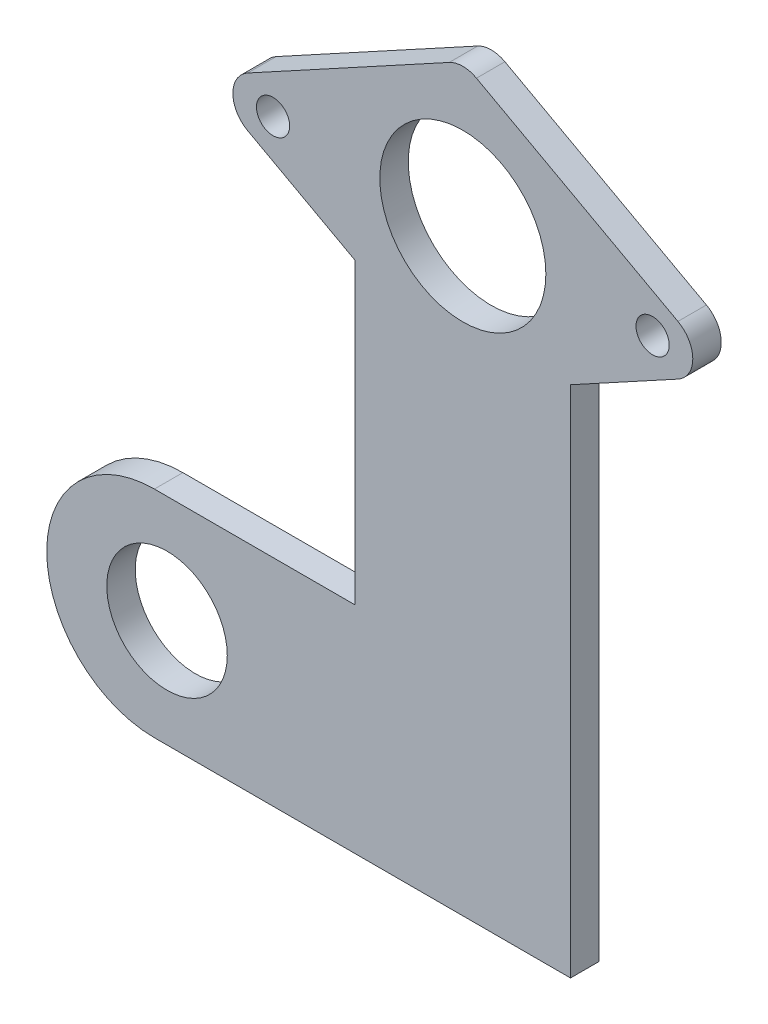
ISO-10303-21;
HEADER;
FILE_DESCRIPTION(('STEP AP214'),'2;1');
FILE_NAME('part.step','',(''),(''),'','','');
FILE_SCHEMA(('AUTOMOTIVE_DESIGN { 1 0 10303 214 1 1 1 1 }'));
ENDSEC;
DATA;
#1=APPLICATION_CONTEXT('core data for automotive mechanical design processes');
#2=APPLICATION_PROTOCOL_DEFINITION('international standard','automotive_design',2000,#1);
#3=PRODUCT_CONTEXT('',#1,'mechanical');
#4=PRODUCT('Part','Part','',(#3));
#5=PRODUCT_RELATED_PRODUCT_CATEGORY('part','',(#4));
#6=PRODUCT_DEFINITION_FORMATION('','',#4);
#7=PRODUCT_DEFINITION_CONTEXT('part definition',#1,'design');
#8=PRODUCT_DEFINITION('design','',#6,#7);
#9=PRODUCT_DEFINITION_SHAPE('','',#8);
#10=(LENGTH_UNIT() NAMED_UNIT(*) SI_UNIT(.MILLI.,.METRE.));
#11=(NAMED_UNIT(*) PLANE_ANGLE_UNIT() SI_UNIT($,.RADIAN.));
#12=(NAMED_UNIT(*) SI_UNIT($,.STERADIAN.) SOLID_ANGLE_UNIT());
#13=UNCERTAINTY_MEASURE_WITH_UNIT(LENGTH_MEASURE(1.E-05),#10,'distance_accuracy_value','');
#14=(GEOMETRIC_REPRESENTATION_CONTEXT(3) GLOBAL_UNCERTAINTY_ASSIGNED_CONTEXT((#13)) GLOBAL_UNIT_ASSIGNED_CONTEXT((#10,
#11,#12)) REPRESENTATION_CONTEXT('',''));
#15=CARTESIAN_POINT('',(0.,0.,0.));
#16=DIRECTION('',(0.,0.,1.));
#17=DIRECTION('',(1.,0.,0.));
#18=AXIS2_PLACEMENT_3D('',#15,#16,#17);
#19=CARTESIAN_POINT('',(-12.6114649681529,-23.1210191082803,6.));
#20=DIRECTION('',(-0.478852130680573,-0.877895572914384,0.));
#21=DIRECTION('',(0.877895572914385,-0.478852130680573,0.));
#22=AXIS2_PLACEMENT_3D('',#19,#20,#21);
#23=PLANE('',#22);
#24=DIRECTION('',(-0.877895572914384,0.478852130680573,0.));
#25=VECTOR('',#24,1.);
#26=CARTESIAN_POINT('',(-12.6114649681529,-23.1210191082803,0.));
#27=LINE('',#26,#25);
#28=CARTESIAN_POINT('',(-22.7,-17.6181818181818,0.));
#29=VERTEX_POINT('',#28);
#30=CARTESIAN_POINT('',(-45.3431486979417,-5.26737343748635,0.));
#31=VERTEX_POINT('',#30);
#32=EDGE_CURVE('E182',#29,#31,#27,.T.);
#33=ORIENTED_EDGE('',*,*,#32,.F.);
#34=DIRECTION('',(0.,0.,-1.));
#35=VECTOR('',#34,1.);
#36=CARTESIAN_POINT('',(-22.7,-17.6181818181818,6.));
#37=LINE('',#36,#35);
#38=CARTESIAN_POINT('',(-22.7,-17.6181818181818,6.));
#39=VERTEX_POINT('',#38);
#40=EDGE_CURVE('E11',#39,#29,#37,.T.);
#41=ORIENTED_EDGE('',*,*,#40,.F.);
#42=DIRECTION('',(-0.877895572914384,0.478852130680573,0.));
#43=VECTOR('',#42,1.);
#44=CARTESIAN_POINT('',(-12.6114649681529,-23.1210191082803,6.));
#45=LINE('',#44,#43);
#46=CARTESIAN_POINT('',(-45.3431486979417,-5.26737343748635,6.));
#47=VERTEX_POINT('',#46);
#48=EDGE_CURVE('E231',#39,#47,#45,.T.);
#49=ORIENTED_EDGE('',*,*,#48,.T.);
#50=DIRECTION('',(0.,0.,-1.));
#51=VECTOR('',#50,1.);
#52=CARTESIAN_POINT('',(-45.3431486979417,-5.26737343748635,6.));
#53=LINE('',#52,#51);
#54=EDGE_CURVE('E57',#47,#31,#53,.T.);
#55=ORIENTED_EDGE('',*,*,#54,.T.);
#56=EDGE_LOOP('',(#33,#41,#49,#55));
#57=FACE_BOUND('',#56,.T.);
#58=ADVANCED_FACE('F41',(#57),#23,.T.);
#59=CARTESIAN_POINT('',(-22.7,0.,6.));
#60=DIRECTION('',(-1.,0.,0.));
#61=DIRECTION('',(0.,-1.,0.));
#62=AXIS2_PLACEMENT_3D('',#59,#60,#61);
#63=PLANE('',#62);
#64=DIRECTION('',(0.,1.,0.));
#65=VECTOR('',#64,1.);
#66=CARTESIAN_POINT('',(-22.7,0.,0.));
#67=LINE('',#66,#65);
#68=CARTESIAN_POINT('',(-22.7,-80.51,0.));
#69=VERTEX_POINT('',#68);
#70=EDGE_CURVE('E184',#69,#29,#67,.T.);
#71=ORIENTED_EDGE('',*,*,#70,.F.);
#72=DIRECTION('',(0.,0.,-1.));
#73=VECTOR('',#72,1.);
#74=CARTESIAN_POINT('',(-22.7,-80.51,6.));
#75=LINE('',#74,#73);
#76=CARTESIAN_POINT('',(-22.7,-80.51,6.));
#77=VERTEX_POINT('',#76);
#78=EDGE_CURVE('E49',#77,#69,#75,.T.);
#79=ORIENTED_EDGE('',*,*,#78,.F.);
#80=DIRECTION('',(0.,1.,0.));
#81=VECTOR('',#80,1.);
#82=CARTESIAN_POINT('',(-22.7,0.,6.));
#83=LINE('',#82,#81);
#84=EDGE_CURVE('E276',#77,#39,#83,.T.);
#85=ORIENTED_EDGE('',*,*,#84,.T.);
#86=ORIENTED_EDGE('',*,*,#40,.T.);
#87=EDGE_LOOP('',(#71,#79,#85,#86));
#88=FACE_BOUND('',#87,.T.);
#89=ADVANCED_FACE('F261',(#88),#63,.T.);
#90=CARTESIAN_POINT('',(0.,-80.51,6.));
#91=DIRECTION('',(0.,1.,0.));
#92=DIRECTION('',(0.,0.,1.));
#93=AXIS2_PLACEMENT_3D('',#90,#91,#92);
#94=PLANE('',#93);
#95=DIRECTION('',(1.,0.,0.));
#96=VECTOR('',#95,1.);
#97=CARTESIAN_POINT('',(0.,-80.51,0.));
#98=LINE('',#97,#96);
#99=CARTESIAN_POINT('',(-65.0099999999998,-80.51,0.));
#100=VERTEX_POINT('',#99);
#101=EDGE_CURVE('E187',#100,#69,#98,.T.);
#102=ORIENTED_EDGE('',*,*,#101,.F.);
#103=DIRECTION('',(0.,0.,-1.));
#104=VECTOR('',#103,1.);
#105=CARTESIAN_POINT('',(-65.0099999999998,-80.51,6.));
#106=LINE('',#105,#104);
#107=CARTESIAN_POINT('',(-65.0099999999998,-80.51,6.));
#108=VERTEX_POINT('',#107);
#109=EDGE_CURVE('E250',#108,#100,#106,.T.);
#110=ORIENTED_EDGE('',*,*,#109,.F.);
#111=DIRECTION('',(1.,0.,0.));
#112=VECTOR('',#111,1.);
#113=CARTESIAN_POINT('',(0.,-80.51,6.));
#114=LINE('',#113,#112);
#115=EDGE_CURVE('E257',#108,#77,#114,.T.);
#116=ORIENTED_EDGE('',*,*,#115,.T.);
#117=ORIENTED_EDGE('',*,*,#78,.T.);
#118=EDGE_LOOP('',(#102,#110,#116,#117));
#119=FACE_BOUND('',#118,.T.);
#120=ADVANCED_FACE('F255',(#119),#94,.T.);
#121=CARTESIAN_POINT('',(-65.01,-103.2,6.));
#122=DIRECTION('',(0.,0.,-1.));
#123=DIRECTION('',(-1.,0.,0.));
#124=AXIS2_PLACEMENT_3D('',#121,#122,#123);
#125=CYLINDRICAL_SURFACE('',#124,22.69);
#126=CARTESIAN_POINT('',(-65.01,-103.2,0.));
#127=DIRECTION('',(0.,0.,1.));
#128=DIRECTION('',(1.,0.,0.));
#129=AXIS2_PLACEMENT_3D('',#126,#127,#128);
#130=CIRCLE('',#129,22.69);
#131=CARTESIAN_POINT('',(-87.7,-103.2,0.));
#132=VERTEX_POINT('',#131);
#133=EDGE_CURVE('E190',#100,#132,#130,.T.);
#134=ORIENTED_EDGE('',*,*,#133,.T.);
#135=DIRECTION('',(0.,0.,-1.));
#136=VECTOR('',#135,1.);
#137=CARTESIAN_POINT('',(-87.7,-103.2,6.));
#138=LINE('',#137,#136);
#139=CARTESIAN_POINT('',(-87.7,-103.2,6.));
#140=VERTEX_POINT('',#139);
#141=EDGE_CURVE('E248',#140,#132,#138,.T.);
#142=ORIENTED_EDGE('',*,*,#141,.F.);
#143=CARTESIAN_POINT('',(-65.01,-103.2,6.));
#144=DIRECTION('',(0.,0.,1.));
#145=DIRECTION('',(1.,0.,0.));
#146=AXIS2_PLACEMENT_3D('',#143,#144,#145);
#147=CIRCLE('',#146,22.69);
#148=EDGE_CURVE('E272',#108,#140,#147,.T.);
#149=ORIENTED_EDGE('',*,*,#148,.F.);
#150=ORIENTED_EDGE('',*,*,#109,.T.);
#151=EDGE_LOOP('',(#134,#142,#149,#150));
#152=FACE_BOUND('',#151,.T.);
#153=ADVANCED_FACE('F269',(#152),#125,.T.);
#154=CARTESIAN_POINT('',(-87.7,0.,6.));
#155=DIRECTION('',(-1.,0.,0.));
#156=DIRECTION('',(0.,0.,1.));
#157=AXIS2_PLACEMENT_3D('',#154,#155,#156);
#158=PLANE('',#157);
#159=DIRECTION('',(0.,1.,0.));
#160=VECTOR('',#159,1.);
#161=CARTESIAN_POINT('',(-87.7,0.,0.));
#162=LINE('',#161,#160);
#163=CARTESIAN_POINT('',(-87.7,-103.22,0.));
#164=VERTEX_POINT('',#163);
#165=EDGE_CURVE('E193',#164,#132,#162,.T.);
#166=ORIENTED_EDGE('',*,*,#165,.F.);
#167=DIRECTION('',(0.,0.,-1.));
#168=VECTOR('',#167,1.);
#169=CARTESIAN_POINT('',(-87.7,-103.22,6.));
#170=LINE('',#169,#168);
#171=CARTESIAN_POINT('',(-87.7,-103.22,6.));
#172=VERTEX_POINT('',#171);
#173=EDGE_CURVE('E246',#172,#164,#170,.T.);
#174=ORIENTED_EDGE('',*,*,#173,.F.);
#175=DIRECTION('',(0.,1.,0.));
#176=VECTOR('',#175,1.);
#177=CARTESIAN_POINT('',(-87.7,0.,6.));
#178=LINE('',#177,#176);
#179=EDGE_CURVE('E274',#172,#140,#178,.T.);
#180=ORIENTED_EDGE('',*,*,#179,.T.);
#181=ORIENTED_EDGE('',*,*,#141,.T.);
#182=EDGE_LOOP('',(#166,#174,#180,#181));
#183=FACE_BOUND('',#182,.T.);
#184=ADVANCED_FACE('F324',(#183),#158,.T.);
#185=CARTESIAN_POINT('',(-65.01,-103.22,6.));
#186=DIRECTION('',(0.,0.,-1.));
#187=DIRECTION('',(-1.,0.,0.));
#188=AXIS2_PLACEMENT_3D('',#185,#186,#187);
#189=CYLINDRICAL_SURFACE('',#188,22.69);
#190=CARTESIAN_POINT('',(-65.01,-103.22,0.));
#191=DIRECTION('',(0.,0.,1.));
#192=DIRECTION('',(1.,0.,0.));
#193=AXIS2_PLACEMENT_3D('',#190,#191,#192);
#194=CIRCLE('',#193,22.69);
#195=CARTESIAN_POINT('',(-65.0099999999998,-125.91,0.));
#196=VERTEX_POINT('',#195);
#197=EDGE_CURVE('E196',#196,#164,#194,.F.);
#198=ORIENTED_EDGE('',*,*,#197,.F.);
#199=DIRECTION('',(0.,0.,-1.));
#200=VECTOR('',#199,1.);
#201=CARTESIAN_POINT('',(-65.0099999999998,-125.91,6.));
#202=LINE('',#201,#200);
#203=CARTESIAN_POINT('',(-65.0099999999998,-125.91,6.));
#204=VERTEX_POINT('',#203);
#205=EDGE_CURVE('E244',#204,#196,#202,.T.);
#206=ORIENTED_EDGE('',*,*,#205,.F.);
#207=CARTESIAN_POINT('',(-65.01,-103.22,6.));
#208=DIRECTION('',(0.,0.,1.));
#209=DIRECTION('',(1.,0.,0.));
#210=AXIS2_PLACEMENT_3D('',#207,#208,#209);
#211=CIRCLE('',#210,22.69);
#212=EDGE_CURVE('E282',#204,#172,#211,.F.);
#213=ORIENTED_EDGE('',*,*,#212,.T.);
#214=ORIENTED_EDGE('',*,*,#173,.T.);
#215=EDGE_LOOP('',(#198,#206,#213,#214));
#216=FACE_BOUND('',#215,.T.);
#217=ADVANCED_FACE('F327',(#216),#189,.T.);
#218=CARTESIAN_POINT('',(0.,-125.91,6.));
#219=DIRECTION('',(0.,1.,0.));
#220=DIRECTION('',(-1.,0.,0.));
#221=AXIS2_PLACEMENT_3D('',#218,#219,#220);
#222=PLANE('',#221);
#223=DIRECTION('',(1.,0.,0.));
#224=VECTOR('',#223,1.);
#225=CARTESIAN_POINT('',(0.,-125.91,0.));
#226=LINE('',#225,#224);
#227=CARTESIAN_POINT('',(22.7,-125.91,0.));
#228=VERTEX_POINT('',#227);
#229=EDGE_CURVE('E199',#196,#228,#226,.T.);
#230=ORIENTED_EDGE('',*,*,#229,.T.);
#231=DIRECTION('',(0.,0.,-1.));
#232=VECTOR('',#231,1.);
#233=CARTESIAN_POINT('',(22.7,-125.91,6.));
#234=LINE('',#233,#232);
#235=CARTESIAN_POINT('',(22.7,-125.91,6.));
#236=VERTEX_POINT('',#235);
#237=EDGE_CURVE('E241',#236,#228,#234,.T.);
#238=ORIENTED_EDGE('',*,*,#237,.F.);
#239=DIRECTION('',(1.,0.,0.));
#240=VECTOR('',#239,1.);
#241=CARTESIAN_POINT('',(0.,-125.91,6.));
#242=LINE('',#241,#240);
#243=EDGE_CURVE('E285',#204,#236,#242,.T.);
#244=ORIENTED_EDGE('',*,*,#243,.F.);
#245=ORIENTED_EDGE('',*,*,#205,.T.);
#246=EDGE_LOOP('',(#230,#238,#244,#245));
#247=FACE_BOUND('',#246,.T.);
#248=ADVANCED_FACE('F331',(#247),#222,.F.);
#249=CARTESIAN_POINT('',(22.7,0.,6.));
#250=DIRECTION('',(-1.,0.,0.));
#251=DIRECTION('',(0.,0.,1.));
#252=AXIS2_PLACEMENT_3D('',#249,#250,#251);
#253=PLANE('',#252);
#254=DIRECTION('',(0.,1.,0.));
#255=VECTOR('',#254,1.);
#256=CARTESIAN_POINT('',(22.7,0.,0.));
#257=LINE('',#256,#255);
#258=CARTESIAN_POINT('',(22.7,-17.6181818181818,0.));
#259=VERTEX_POINT('',#258);
#260=EDGE_CURVE('E201',#228,#259,#257,.T.);
#261=ORIENTED_EDGE('',*,*,#260,.T.);
#262=DIRECTION('',(0.,0.,-1.));
#263=VECTOR('',#262,1.);
#264=CARTESIAN_POINT('',(22.7,-17.6181818181818,6.));
#265=LINE('',#264,#263);
#266=CARTESIAN_POINT('',(22.7,-17.6181818181818,6.));
#267=VERTEX_POINT('',#266);
#268=EDGE_CURVE('E239',#267,#259,#265,.T.);
#269=ORIENTED_EDGE('',*,*,#268,.F.);
#270=DIRECTION('',(0.,1.,0.));
#271=VECTOR('',#270,1.);
#272=CARTESIAN_POINT('',(22.7,0.,6.));
#273=LINE('',#272,#271);
#274=EDGE_CURVE('E287',#236,#267,#273,.T.);
#275=ORIENTED_EDGE('',*,*,#274,.F.);
#276=ORIENTED_EDGE('',*,*,#237,.T.);
#277=EDGE_LOOP('',(#261,#269,#275,#276));
#278=FACE_BOUND('',#277,.T.);
#279=ADVANCED_FACE('F335',(#278),#253,.F.);
#280=CARTESIAN_POINT('',(12.6114649681529,-23.1210191082803,6.));
#281=DIRECTION('',(0.478852130680573,-0.877895572914384,0.));
#282=DIRECTION('',(0.877895572914385,0.478852130680573,0.));
#283=AXIS2_PLACEMENT_3D('',#280,#281,#282);
#284=PLANE('',#283);
#285=DIRECTION('',(-0.877895572914384,-0.478852130680573,0.));
#286=VECTOR('',#285,1.);
#287=CARTESIAN_POINT('',(12.6114649681529,-23.1210191082803,0.));
#288=LINE('',#287,#286);
#289=CARTESIAN_POINT('',(45.3431486979417,-5.26737343748635,0.));
#290=VERTEX_POINT('',#289);
#291=EDGE_CURVE('E204',#290,#259,#288,.T.);
#292=ORIENTED_EDGE('',*,*,#291,.F.);
#293=DIRECTION('',(0.,0.,-1.));
#294=VECTOR('',#293,1.);
#295=CARTESIAN_POINT('',(45.3431486979417,-5.26737343748635,6.));
#296=LINE('',#295,#294);
#297=CARTESIAN_POINT('',(45.3431486979417,-5.26737343748635,6.));
#298=VERTEX_POINT('',#297);
#299=EDGE_CURVE('E237',#298,#290,#296,.T.);
#300=ORIENTED_EDGE('',*,*,#299,.F.);
#301=DIRECTION('',(-0.877895572914384,-0.478852130680573,0.));
#302=VECTOR('',#301,1.);
#303=CARTESIAN_POINT('',(12.6114649681529,-23.1210191082803,6.));
#304=LINE('',#303,#302);
#305=EDGE_CURVE('E289',#298,#267,#304,.T.);
#306=ORIENTED_EDGE('',*,*,#305,.T.);
#307=ORIENTED_EDGE('',*,*,#268,.T.);
#308=EDGE_LOOP('',(#292,#300,#306,#307));
#309=FACE_BOUND('',#308,.T.);
#310=ADVANCED_FACE('F339',(#309),#284,.T.);
#311=CARTESIAN_POINT('',(42.4700359138583,0.,6.));
#312=DIRECTION('',(0.,0.,-1.));
#313=DIRECTION('',(-1.,0.,0.));
#314=AXIS2_PLACEMENT_3D('',#311,#312,#313);
#315=CYLINDRICAL_SURFACE('',#314,6.);
#316=CARTESIAN_POINT('',(42.4700359138583,0.,0.));
#317=DIRECTION('',(0.,0.,1.));
#318=DIRECTION('',(1.,0.,0.));
#319=AXIS2_PLACEMENT_3D('',#316,#317,#318);
#320=CIRCLE('',#319,6.);
#321=CARTESIAN_POINT('',(45.3431486979417,5.26737343748636,0.));
#322=VERTEX_POINT('',#321);
#323=EDGE_CURVE('E207',#290,#322,#320,.T.);
#324=ORIENTED_EDGE('',*,*,#323,.T.);
#325=DIRECTION('',(0.,0.,-1.));
#326=VECTOR('',#325,1.);
#327=CARTESIAN_POINT('',(45.3431486979417,5.26737343748636,6.));
#328=LINE('',#327,#326);
#329=CARTESIAN_POINT('',(45.3431486979417,5.26737343748636,6.));
#330=VERTEX_POINT('',#329);
#331=EDGE_CURVE('E235',#330,#322,#328,.T.);
#332=ORIENTED_EDGE('',*,*,#331,.F.);
#333=CARTESIAN_POINT('',(42.4700359138583,0.,6.));
#334=DIRECTION('',(0.,0.,1.));
#335=DIRECTION('',(1.,0.,0.));
#336=AXIS2_PLACEMENT_3D('',#333,#334,#335);
#337=CIRCLE('',#336,6.);
#338=EDGE_CURVE('E292',#298,#330,#337,.T.);
#339=ORIENTED_EDGE('',*,*,#338,.F.);
#340=ORIENTED_EDGE('',*,*,#299,.T.);
#341=EDGE_LOOP('',(#324,#332,#339,#340));
#342=FACE_BOUND('',#341,.T.);
#343=ADVANCED_FACE('F343',(#342),#315,.T.);
#344=CARTESIAN_POINT('',(12.6114649681529,23.1210191082803,6.));
#345=DIRECTION('',(0.478852130680573,0.877895572914384,0.));
#346=DIRECTION('',(-0.877895572914385,0.478852130680573,0.));
#347=AXIS2_PLACEMENT_3D('',#344,#345,#346);
#348=PLANE('',#347);
#349=DIRECTION('',(0.877895572914384,-0.478852130680573,0.));
#350=VECTOR('',#349,1.);
#351=CARTESIAN_POINT('',(12.6114649681529,23.1210191082803,0.));
#352=LINE('',#351,#350);
#353=CARTESIAN_POINT('',(2.87311278408346,28.4328475723181,0.));
#354=VERTEX_POINT('',#353);
#355=EDGE_CURVE('E210',#354,#322,#352,.T.);
#356=ORIENTED_EDGE('',*,*,#355,.F.);
#357=DIRECTION('',(0.,0.,-1.));
#358=VECTOR('',#357,1.);
#359=CARTESIAN_POINT('',(2.87311278408346,28.4328475723181,6.));
#360=LINE('',#359,#358);
#361=CARTESIAN_POINT('',(2.87311278408346,28.4328475723181,6.));
#362=VERTEX_POINT('',#361);
#363=EDGE_CURVE('E162',#362,#354,#360,.T.);
#364=ORIENTED_EDGE('',*,*,#363,.F.);
#365=DIRECTION('',(0.877895572914384,-0.478852130680573,0.));
#366=VECTOR('',#365,1.);
#367=CARTESIAN_POINT('',(12.6114649681529,23.1210191082803,6.));
#368=LINE('',#367,#366);
#369=EDGE_CURVE('E152',#362,#330,#368,.T.);
#370=ORIENTED_EDGE('',*,*,#369,.T.);
#371=ORIENTED_EDGE('',*,*,#331,.T.);
#372=EDGE_LOOP('',(#356,#364,#370,#371));
#373=FACE_BOUND('',#372,.T.);
#374=ADVANCED_FACE('F295',(#373),#348,.T.);
#375=CARTESIAN_POINT('',(0.,23.1654741348318,6.));
#376=DIRECTION('',(0.,0.,-1.));
#377=DIRECTION('',(-1.,0.,0.));
#378=AXIS2_PLACEMENT_3D('',#375,#376,#377);
#379=CYLINDRICAL_SURFACE('',#378,6.);
#380=CARTESIAN_POINT('',(0.,23.1654741348318,0.));
#381=DIRECTION('',(0.,0.,1.));
#382=DIRECTION('',(1.,0.,0.));
#383=AXIS2_PLACEMENT_3D('',#380,#381,#382);
#384=CIRCLE('',#383,6.);
#385=CARTESIAN_POINT('',(-2.87311278408346,28.4328475723181,0.));
#386=VERTEX_POINT('',#385);
#387=EDGE_CURVE('E159',#354,#386,#384,.T.);
#388=ORIENTED_EDGE('',*,*,#387,.T.);
#389=DIRECTION('',(0.,0.,-1.));
#390=VECTOR('',#389,1.);
#391=CARTESIAN_POINT('',(-2.87311278408346,28.4328475723181,6.));
#392=LINE('',#391,#390);
#393=CARTESIAN_POINT('',(-2.87311278408346,28.4328475723181,6.));
#394=VERTEX_POINT('',#393);
#395=EDGE_CURVE('E156',#394,#386,#392,.T.);
#396=ORIENTED_EDGE('',*,*,#395,.F.);
#397=CARTESIAN_POINT('',(0.,23.1654741348318,6.));
#398=DIRECTION('',(0.,0.,1.));
#399=DIRECTION('',(1.,0.,0.));
#400=AXIS2_PLACEMENT_3D('',#397,#398,#399);
#401=CIRCLE('',#400,6.);
#402=EDGE_CURVE('E144',#362,#394,#401,.T.);
#403=ORIENTED_EDGE('',*,*,#402,.F.);
#404=ORIENTED_EDGE('',*,*,#363,.T.);
#405=EDGE_LOOP('',(#388,#396,#403,#404));
#406=FACE_BOUND('',#405,.T.);
#407=ADVANCED_FACE('F157',(#406),#379,.T.);
#408=CARTESIAN_POINT('',(-12.6114649681529,23.1210191082803,6.));
#409=DIRECTION('',(-0.478852130680573,0.877895572914384,0.));
#410=DIRECTION('',(-0.877895572914385,-0.478852130680573,0.));
#411=AXIS2_PLACEMENT_3D('',#408,#409,#410);
#412=PLANE('',#411);
#413=DIRECTION('',(0.877895572914384,0.478852130680573,0.));
#414=VECTOR('',#413,1.);
#415=CARTESIAN_POINT('',(-12.6114649681529,23.1210191082803,0.));
#416=LINE('',#415,#414);
#417=CARTESIAN_POINT('',(-45.3431486979417,5.26737343748635,0.));
#418=VERTEX_POINT('',#417);
#419=EDGE_CURVE('E214',#418,#386,#416,.T.);
#420=ORIENTED_EDGE('',*,*,#419,.F.);
#421=DIRECTION('',(0.,0.,-1.));
#422=VECTOR('',#421,1.);
#423=CARTESIAN_POINT('',(-45.3431486979417,5.26737343748635,6.));
#424=LINE('',#423,#422);
#425=CARTESIAN_POINT('',(-45.3431486979417,5.26737343748635,6.));
#426=VERTEX_POINT('',#425);
#427=EDGE_CURVE('E100',#426,#418,#424,.T.);
#428=ORIENTED_EDGE('',*,*,#427,.F.);
#429=DIRECTION('',(0.877895572914384,0.478852130680573,0.));
#430=VECTOR('',#429,1.);
#431=CARTESIAN_POINT('',(-12.6114649681529,23.1210191082803,6.));
#432=LINE('',#431,#430);
#433=EDGE_CURVE('E150',#426,#394,#432,.T.);
#434=ORIENTED_EDGE('',*,*,#433,.T.);
#435=ORIENTED_EDGE('',*,*,#395,.T.);
#436=EDGE_LOOP('',(#420,#428,#434,#435));
#437=FACE_BOUND('',#436,.T.);
#438=ADVANCED_FACE('F164',(#437),#412,.T.);
#439=CARTESIAN_POINT('',(-40.,0.,6.));
#440=DIRECTION('',(0.,0.,-1.));
#441=DIRECTION('',(-1.,0.,0.));
#442=AXIS2_PLACEMENT_3D('',#439,#440,#441);
#443=CYLINDRICAL_SURFACE('',#442,3.5);
#444=CARTESIAN_POINT('',(-40.,0.,6.));
#445=DIRECTION('',(0.,0.,1.));
#446=DIRECTION('',(1.,0.,0.));
#447=AXIS2_PLACEMENT_3D('',#444,#445,#446);
#448=CIRCLE('',#447,3.5);
#449=CARTESIAN_POINT('',(-36.5,0.,6.));
#450=VERTEX_POINT('',#449);
#451=EDGE_CURVE('E176',#450,#450,#448,.T.);
#452=ORIENTED_EDGE('',*,*,#451,.T.);
#453=EDGE_LOOP('',(#452));
#454=FACE_BOUND('',#453,.T.);
#455=CARTESIAN_POINT('',(-40.,0.,0.));
#456=DIRECTION('',(0.,0.,1.));
#457=DIRECTION('',(1.,0.,0.));
#458=AXIS2_PLACEMENT_3D('',#455,#456,#457);
#459=CIRCLE('',#458,3.5);
#460=CARTESIAN_POINT('',(-36.5,0.,0.));
#461=VERTEX_POINT('',#460);
#462=EDGE_CURVE('E225',#461,#461,#459,.T.);
#463=ORIENTED_EDGE('',*,*,#462,.F.);
#464=EDGE_LOOP('',(#463));
#465=FACE_BOUND('',#464,.T.);
#466=ADVANCED_FACE('F352',(#454,#465),#443,.F.);
#467=CARTESIAN_POINT('',(40.,0.,6.));
#468=DIRECTION('',(0.,0.,-1.));
#469=DIRECTION('',(-1.,0.,0.));
#470=AXIS2_PLACEMENT_3D('',#467,#468,#469);
#471=CYLINDRICAL_SURFACE('',#470,3.5);
#472=CARTESIAN_POINT('',(40.,0.,6.));
#473=DIRECTION('',(0.,0.,1.));
#474=DIRECTION('',(1.,0.,0.));
#475=AXIS2_PLACEMENT_3D('',#472,#473,#474);
#476=CIRCLE('',#475,3.5);
#477=CARTESIAN_POINT('',(43.5,0.,6.));
#478=VERTEX_POINT('',#477);
#479=EDGE_CURVE('E173',#478,#478,#476,.T.);
#480=ORIENTED_EDGE('',*,*,#479,.T.);
#481=EDGE_LOOP('',(#480));
#482=FACE_BOUND('',#481,.T.);
#483=CARTESIAN_POINT('',(40.,0.,0.));
#484=DIRECTION('',(0.,0.,1.));
#485=DIRECTION('',(1.,0.,0.));
#486=AXIS2_PLACEMENT_3D('',#483,#484,#485);
#487=CIRCLE('',#486,3.5);
#488=CARTESIAN_POINT('',(43.5,0.,0.));
#489=VERTEX_POINT('',#488);
#490=EDGE_CURVE('E222',#489,#489,#487,.T.);
#491=ORIENTED_EDGE('',*,*,#490,.F.);
#492=EDGE_LOOP('',(#491));
#493=FACE_BOUND('',#492,.T.);
#494=ADVANCED_FACE('F309',(#482,#493),#471,.F.);
#495=CARTESIAN_POINT('',(0.,0.,6.));
#496=DIRECTION('',(0.,0.,-1.));
#497=DIRECTION('',(-1.,0.,0.));
#498=AXIS2_PLACEMENT_3D('',#495,#496,#497);
#499=CYLINDRICAL_SURFACE('',#498,17.5);
#500=CARTESIAN_POINT('',(0.,0.,6.));
#501=DIRECTION('',(0.,0.,1.));
#502=DIRECTION('',(1.,0.,0.));
#503=AXIS2_PLACEMENT_3D('',#500,#501,#502);
#504=CIRCLE('',#503,17.5);
#505=CARTESIAN_POINT('',(17.5,0.,6.));
#506=VERTEX_POINT('',#505);
#507=EDGE_CURVE('E167',#506,#506,#504,.T.);
#508=ORIENTED_EDGE('',*,*,#507,.T.);
#509=EDGE_LOOP('',(#508));
#510=FACE_BOUND('',#509,.T.);
#511=CARTESIAN_POINT('',(0.,0.,0.));
#512=DIRECTION('',(0.,0.,1.));
#513=DIRECTION('',(1.,0.,0.));
#514=AXIS2_PLACEMENT_3D('',#511,#512,#513);
#515=CIRCLE('',#514,17.5);
#516=CARTESIAN_POINT('',(17.5,0.,0.));
#517=VERTEX_POINT('',#516);
#518=EDGE_CURVE('E219',#517,#517,#515,.T.);
#519=ORIENTED_EDGE('',*,*,#518,.F.);
#520=EDGE_LOOP('',(#519));
#521=FACE_BOUND('',#520,.T.);
#522=ADVANCED_FACE('F301',(#510,#521),#499,.F.);
#523=CARTESIAN_POINT('',(-42.4700359138583,0.,6.));
#524=DIRECTION('',(0.,0.,-1.));
#525=DIRECTION('',(-1.,0.,0.));
#526=AXIS2_PLACEMENT_3D('',#523,#524,#525);
#527=CYLINDRICAL_SURFACE('',#526,6.);
#528=CARTESIAN_POINT('',(-42.4700359138583,0.,0.));
#529=DIRECTION('',(0.,0.,1.));
#530=DIRECTION('',(1.,0.,0.));
#531=AXIS2_PLACEMENT_3D('',#528,#529,#530);
#532=CIRCLE('',#531,6.);
#533=EDGE_CURVE('E216',#31,#418,#532,.F.);
#534=ORIENTED_EDGE('',*,*,#533,.F.);
#535=ORIENTED_EDGE('',*,*,#54,.F.);
#536=CARTESIAN_POINT('',(-42.4700359138583,0.,6.));
#537=DIRECTION('',(0.,0.,1.));
#538=DIRECTION('',(1.,0.,0.));
#539=AXIS2_PLACEMENT_3D('',#536,#537,#538);
#540=CIRCLE('',#539,6.);
#541=EDGE_CURVE('E165',#47,#426,#540,.F.);
#542=ORIENTED_EDGE('',*,*,#541,.T.);
#543=ORIENTED_EDGE('',*,*,#427,.T.);
#544=EDGE_LOOP('',(#534,#535,#542,#543));
#545=FACE_BOUND('',#544,.T.);
#546=ADVANCED_FACE('F298',(#545),#527,.T.);
#547=CARTESIAN_POINT('',(-62.35,-103.21,6.));
#548=DIRECTION('',(0.,0.,-1.));
#549=DIRECTION('',(-1.,0.,0.));
#550=AXIS2_PLACEMENT_3D('',#547,#548,#549);
#551=CYLINDRICAL_SURFACE('',#550,12.7);
#552=CARTESIAN_POINT('',(-62.35,-103.21,6.));
#553=DIRECTION('',(0.,0.,1.));
#554=DIRECTION('',(1.,0.,0.));
#555=AXIS2_PLACEMENT_3D('',#552,#553,#554);
#556=CIRCLE('',#555,12.7);
#557=CARTESIAN_POINT('',(-49.65,-103.21,6.));
#558=VERTEX_POINT('',#557);
#559=EDGE_CURVE('E179',#558,#558,#556,.T.);
#560=ORIENTED_EDGE('',*,*,#559,.T.);
#561=EDGE_LOOP('',(#560));
#562=FACE_BOUND('',#561,.T.);
#563=CARTESIAN_POINT('',(-62.35,-103.21,0.));
#564=DIRECTION('',(0.,0.,1.));
#565=DIRECTION('',(1.,0.,0.));
#566=AXIS2_PLACEMENT_3D('',#563,#564,#565);
#567=CIRCLE('',#566,12.7);
#568=CARTESIAN_POINT('',(-49.65,-103.21,0.));
#569=VERTEX_POINT('',#568);
#570=EDGE_CURVE('E228',#569,#569,#567,.T.);
#571=ORIENTED_EDGE('',*,*,#570,.F.);
#572=EDGE_LOOP('',(#571));
#573=FACE_BOUND('',#572,.T.);
#574=ADVANCED_FACE('F300',(#562,#573),#551,.F.);
#575=CARTESIAN_POINT('',(0.,0.,6.));
#576=DIRECTION('',(0.,0.,1.));
#577=DIRECTION('',(1.,0.,0.));
#578=AXIS2_PLACEMENT_3D('',#575,#576,#577);
#579=PLANE('',#578);
#580=ORIENTED_EDGE('',*,*,#48,.F.);
#581=ORIENTED_EDGE('',*,*,#84,.F.);
#582=ORIENTED_EDGE('',*,*,#115,.F.);
#583=ORIENTED_EDGE('',*,*,#148,.T.);
#584=ORIENTED_EDGE('',*,*,#179,.F.);
#585=ORIENTED_EDGE('',*,*,#212,.F.);
#586=ORIENTED_EDGE('',*,*,#243,.T.);
#587=ORIENTED_EDGE('',*,*,#274,.T.);
#588=ORIENTED_EDGE('',*,*,#305,.F.);
#589=ORIENTED_EDGE('',*,*,#338,.T.);
#590=ORIENTED_EDGE('',*,*,#369,.F.);
#591=ORIENTED_EDGE('',*,*,#402,.T.);
#592=ORIENTED_EDGE('',*,*,#433,.F.);
#593=ORIENTED_EDGE('',*,*,#541,.F.);
#594=EDGE_LOOP('',(#580,#581,#582,#583,#584,#585,#586,#587,#588,#589,#590,#591,#592,#593));
#595=FACE_BOUND('',#594,.T.);
#596=ORIENTED_EDGE('',*,*,#507,.F.);
#597=EDGE_LOOP('',(#596));
#598=FACE_BOUND('',#597,.T.);
#599=ORIENTED_EDGE('',*,*,#479,.F.);
#600=EDGE_LOOP('',(#599));
#601=FACE_BOUND('',#600,.T.);
#602=ORIENTED_EDGE('',*,*,#451,.F.);
#603=EDGE_LOOP('',(#602));
#604=FACE_BOUND('',#603,.T.);
#605=ORIENTED_EDGE('',*,*,#559,.F.);
#606=EDGE_LOOP('',(#605));
#607=FACE_BOUND('',#606,.T.);
#608=ADVANCED_FACE('F146',(#595,#598,#601,#604,#607),#579,.T.);
#609=CARTESIAN_POINT('',(0.,0.,0.));
#610=DIRECTION('',(0.,0.,1.));
#611=DIRECTION('',(1.,0.,0.));
#612=AXIS2_PLACEMENT_3D('',#609,#610,#611);
#613=PLANE('',#612);
#614=ORIENTED_EDGE('',*,*,#32,.T.);
#615=ORIENTED_EDGE('',*,*,#533,.T.);
#616=ORIENTED_EDGE('',*,*,#419,.T.);
#617=ORIENTED_EDGE('',*,*,#387,.F.);
#618=ORIENTED_EDGE('',*,*,#355,.T.);
#619=ORIENTED_EDGE('',*,*,#323,.F.);
#620=ORIENTED_EDGE('',*,*,#291,.T.);
#621=ORIENTED_EDGE('',*,*,#260,.F.);
#622=ORIENTED_EDGE('',*,*,#229,.F.);
#623=ORIENTED_EDGE('',*,*,#197,.T.);
#624=ORIENTED_EDGE('',*,*,#165,.T.);
#625=ORIENTED_EDGE('',*,*,#133,.F.);
#626=ORIENTED_EDGE('',*,*,#101,.T.);
#627=ORIENTED_EDGE('',*,*,#70,.T.);
#628=EDGE_LOOP('',(#614,#615,#616,#617,#618,#619,#620,#621,#622,#623,#624,#625,#626,#627));
#629=FACE_BOUND('',#628,.T.);
#630=ORIENTED_EDGE('',*,*,#518,.T.);
#631=EDGE_LOOP('',(#630));
#632=FACE_BOUND('',#631,.T.);
#633=ORIENTED_EDGE('',*,*,#490,.T.);
#634=EDGE_LOOP('',(#633));
#635=FACE_BOUND('',#634,.T.);
#636=ORIENTED_EDGE('',*,*,#462,.T.);
#637=EDGE_LOOP('',(#636));
#638=FACE_BOUND('',#637,.T.);
#639=ORIENTED_EDGE('',*,*,#570,.T.);
#640=EDGE_LOOP('',(#639));
#641=FACE_BOUND('',#640,.T.);
#642=ADVANCED_FACE('F264',(#629,#632,#635,#638,#641),#613,.F.);
#643=CLOSED_SHELL('',(#58,#89,#120,#153,#184,#217,#248,#279,#310,#343,#374,#407,#438,#466,#494,
#522,#546,#574,#608,#642));
#644=MANIFOLD_SOLID_BREP('B2',#643);
#645=ADVANCED_BREP_SHAPE_REPRESENTATION('',(#18,#644),#14);
#646=SHAPE_DEFINITION_REPRESENTATION(#9,#645);
ENDSEC;
END-ISO-10303-21;
